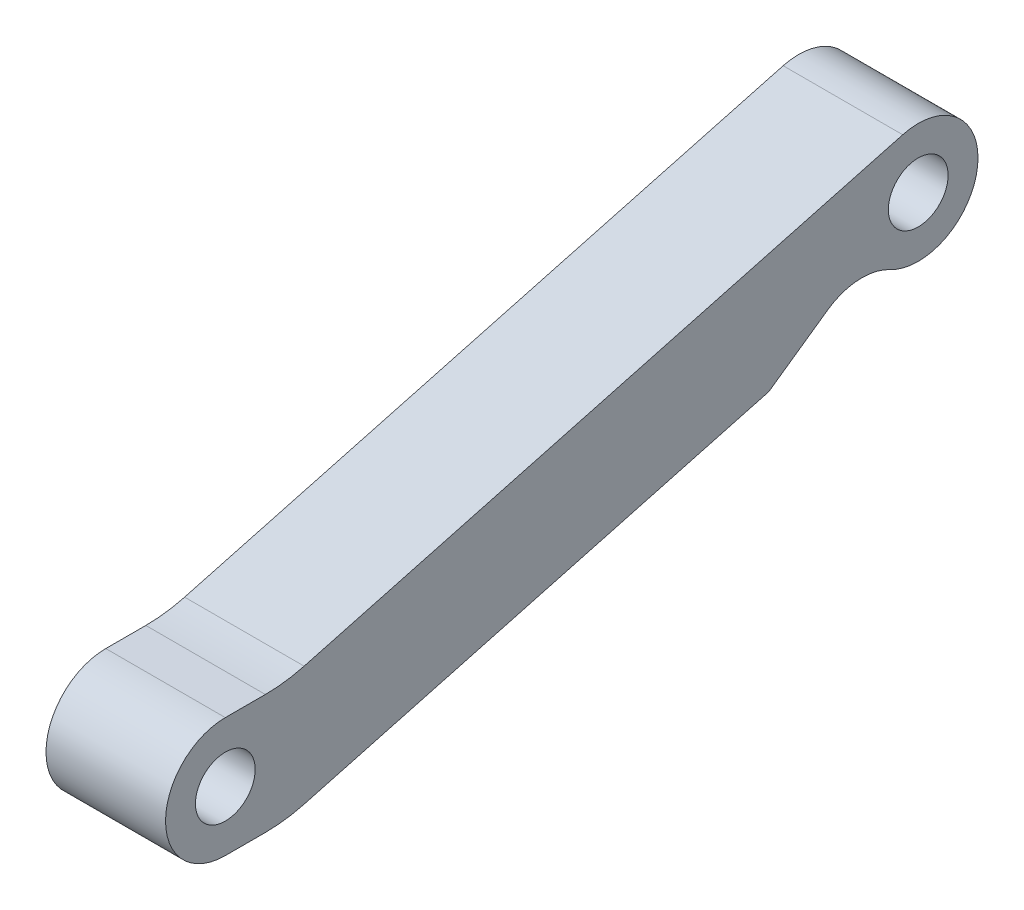
ISO-10303-21;
HEADER;
FILE_DESCRIPTION(('STEP AP214'),'2;1');
FILE_NAME('part.step','',(''),(''),'','','');
FILE_SCHEMA(('AUTOMOTIVE_DESIGN { 1 0 10303 214 1 1 1 1 }'));
ENDSEC;
DATA;
#1=APPLICATION_CONTEXT('core data for automotive mechanical design processes');
#2=APPLICATION_PROTOCOL_DEFINITION('international standard','automotive_design',2000,#1);
#3=PRODUCT_CONTEXT('',#1,'mechanical');
#4=PRODUCT('Part','Part','',(#3));
#5=PRODUCT_RELATED_PRODUCT_CATEGORY('part','',(#4));
#6=PRODUCT_DEFINITION_FORMATION('','',#4);
#7=PRODUCT_DEFINITION_CONTEXT('part definition',#1,'design');
#8=PRODUCT_DEFINITION('design','',#6,#7);
#9=PRODUCT_DEFINITION_SHAPE('','',#8);
#10=(LENGTH_UNIT() NAMED_UNIT(*) SI_UNIT(.MILLI.,.METRE.));
#11=(NAMED_UNIT(*) PLANE_ANGLE_UNIT() SI_UNIT($,.RADIAN.));
#12=(NAMED_UNIT(*) SI_UNIT($,.STERADIAN.) SOLID_ANGLE_UNIT());
#13=UNCERTAINTY_MEASURE_WITH_UNIT(LENGTH_MEASURE(1.E-05),#10,'distance_accuracy_value','');
#14=(GEOMETRIC_REPRESENTATION_CONTEXT(3) GLOBAL_UNCERTAINTY_ASSIGNED_CONTEXT((#13)) GLOBAL_UNIT_ASSIGNED_CONTEXT((#10,
#11,#12)) REPRESENTATION_CONTEXT('',''));
#15=CARTESIAN_POINT('',(0.,0.,0.));
#16=DIRECTION('',(0.,0.,1.));
#17=DIRECTION('',(1.,0.,0.));
#18=AXIS2_PLACEMENT_3D('',#15,#16,#17);
#19=CARTESIAN_POINT('',(-2.,-1.90438017055621,-57.8615520486907));
#20=DIRECTION('',(1.,0.,0.));
#21=DIRECTION('',(0.,0.,-1.));
#22=AXIS2_PLACEMENT_3D('',#19,#20,#21);
#23=CYLINDRICAL_SURFACE('',#22,2.);
#24=DIRECTION('',(1.,0.,0.));
#25=VECTOR('',#24,1.);
#26=CARTESIAN_POINT('',(-2.,-0.139690085278114,-58.8027581381956));
#27=LINE('',#26,#25);
#28=CARTESIAN_POINT('',(-2.,-0.139690085278114,-58.8027581381956));
#29=VERTEX_POINT('',#28);
#30=CARTESIAN_POINT('',(2.,-0.139690085278114,-58.8027581381956));
#31=VERTEX_POINT('',#30);
#32=EDGE_CURVE('E43',#29,#31,#27,.T.);
#33=ORIENTED_EDGE('',*,*,#32,.T.);
#34=CARTESIAN_POINT('',(2.,-1.90438017055621,-57.8615520486907));
#35=DIRECTION('',(1.,0.,0.));
#36=DIRECTION('',(0.,0.,-1.));
#37=AXIS2_PLACEMENT_3D('',#34,#35,#36);
#38=CIRCLE('',#37,2.);
#39=CARTESIAN_POINT('',(2.,-0.267057165237533,-56.7129993175311));
#40=VERTEX_POINT('',#39);
#41=EDGE_CURVE('E120',#31,#40,#38,.T.);
#42=ORIENTED_EDGE('',*,*,#41,.T.);
#43=DIRECTION('',(1.,0.,0.));
#44=VECTOR('',#43,1.);
#45=CARTESIAN_POINT('',(-2.,-0.267057165237533,-56.7129993175311));
#46=LINE('',#45,#44);
#47=CARTESIAN_POINT('',(-2.,-0.267057165237533,-56.7129993175311));
#48=VERTEX_POINT('',#47);
#49=EDGE_CURVE('E11',#48,#40,#46,.T.);
#50=ORIENTED_EDGE('',*,*,#49,.F.);
#51=CARTESIAN_POINT('',(-2.,-1.90438017055621,-57.8615520486907));
#52=DIRECTION('',(1.,0.,0.));
#53=DIRECTION('',(0.,0.,-1.));
#54=AXIS2_PLACEMENT_3D('',#51,#52,#53);
#55=CIRCLE('',#54,2.);
#56=EDGE_CURVE('E56',#29,#48,#55,.T.);
#57=ORIENTED_EDGE('',*,*,#56,.F.);
#58=EDGE_LOOP('',(#33,#42,#50,#57));
#59=FACE_BOUND('',#58,.T.);
#60=ADVANCED_FACE('F39',(#59),#23,.F.);
#61=CARTESIAN_POINT('',(-2.,-26.8419168625447,-18.8291234056378));
#62=DIRECTION('',(0.,-0.818661502659338,-0.574276365579809));
#63=DIRECTION('',(0.,0.574276365579809,-0.818661502659338));
#64=AXIS2_PLACEMENT_3D('',#61,#62,#63);
#65=PLANE('',#64);
#66=ORIENTED_EDGE('',*,*,#49,.T.);
#67=DIRECTION('',(0.,0.574276365579809,-0.818661502659338));
#68=VECTOR('',#67,1.);
#69=CARTESIAN_POINT('',(2.,-26.8419168625447,-18.8291234056378));
#70=LINE('',#69,#68);
#71=CARTESIAN_POINT('',(2.,-1.64829997611087,-54.7439642277006));
#72=VERTEX_POINT('',#71);
#73=EDGE_CURVE('E137',#72,#40,#70,.T.);
#74=ORIENTED_EDGE('',*,*,#73,.F.);
#75=DIRECTION('',(1.,0.,0.));
#76=VECTOR('',#75,1.);
#77=CARTESIAN_POINT('',(-2.,-1.64829997611087,-54.7439642277006));
#78=LINE('',#77,#76);
#79=CARTESIAN_POINT('',(-2.,-1.64829997611087,-54.7439642277006));
#80=VERTEX_POINT('',#79);
#81=EDGE_CURVE('E48',#80,#72,#78,.T.);
#82=ORIENTED_EDGE('',*,*,#81,.F.);
#83=DIRECTION('',(0.,0.574276365579809,-0.818661502659338));
#84=VECTOR('',#83,1.);
#85=CARTESIAN_POINT('',(-2.,-26.8419168625447,-18.8291234056378));
#86=LINE('',#85,#84);
#87=EDGE_CURVE('E124',#80,#48,#86,.T.);
#88=ORIENTED_EDGE('',*,*,#87,.T.);
#89=EDGE_LOOP('',(#66,#74,#82,#88));
#90=FACE_BOUND('',#89,.T.);
#91=ADVANCED_FACE('F232',(#90),#65,.T.);
#92=CARTESIAN_POINT('',(-2.,-15.2636719956812,-4.10387449343897));
#93=DIRECTION('',(0.,-0.965704257834634,-0.259644538552343));
#94=DIRECTION('',(0.,0.259644538552343,-0.965704257834634));
#95=AXIS2_PLACEMENT_3D('',#92,#93,#94);
#96=PLANE('',#95);
#97=ORIENTED_EDGE('',*,*,#81,.T.);
#98=DIRECTION('',(0.,0.259644538552343,-0.965704257834634));
#99=VECTOR('',#98,1.);
#100=CARTESIAN_POINT('',(2.,-15.2636719956812,-4.10387449343897));
#101=LINE('',#100,#99);
#102=CARTESIAN_POINT('',(2.,-5.82852128917318,-39.1963330577057));
#103=VERTEX_POINT('',#102);
#104=EDGE_CURVE('E161',#103,#72,#101,.T.);
#105=ORIENTED_EDGE('',*,*,#104,.F.);
#106=DIRECTION('',(1.,0.,0.));
#107=VECTOR('',#106,1.);
#108=CARTESIAN_POINT('',(-2.,-5.82852128917318,-39.1963330577057));
#109=LINE('',#108,#107);
#110=CARTESIAN_POINT('',(-2.,-5.82852128917318,-39.1963330577057));
#111=VERTEX_POINT('',#110);
#112=EDGE_CURVE('E192',#111,#103,#109,.T.);
#113=ORIENTED_EDGE('',*,*,#112,.F.);
#114=DIRECTION('',(0.,0.259644538552343,-0.965704257834634));
#115=VECTOR('',#114,1.);
#116=CARTESIAN_POINT('',(-2.,-15.2636719956812,-4.10387449343897));
#117=LINE('',#116,#115);
#118=EDGE_CURVE('E188',#111,#80,#117,.T.);
#119=ORIENTED_EDGE('',*,*,#118,.T.);
#120=EDGE_LOOP('',(#97,#105,#113,#119));
#121=FACE_BOUND('',#120,.T.);
#122=ADVANCED_FACE('F230',(#121),#96,.T.);
#123=CARTESIAN_POINT('',(-2.,-1.00000000000001,-37.8981103649439));
#124=DIRECTION('',(1.,0.,0.));
#125=DIRECTION('',(0.,0.,-1.));
#126=AXIS2_PLACEMENT_3D('',#123,#124,#125);
#127=CYLINDRICAL_SURFACE('',#126,5.);
#128=ORIENTED_EDGE('',*,*,#112,.T.);
#129=CARTESIAN_POINT('',(2.,-1.00000000000001,-37.8981103649439));
#130=DIRECTION('',(1.,0.,0.));
#131=DIRECTION('',(0.,0.,-1.));
#132=AXIS2_PLACEMENT_3D('',#129,#130,#131);
#133=CIRCLE('',#132,5.);
#134=CARTESIAN_POINT('',(2.,-6.00000000000001,-37.8981103649439));
#135=VERTEX_POINT('',#134);
#136=EDGE_CURVE('E158',#135,#103,#133,.T.);
#137=ORIENTED_EDGE('',*,*,#136,.F.);
#138=DIRECTION('',(1.,0.,0.));
#139=VECTOR('',#138,1.);
#140=CARTESIAN_POINT('',(-2.,-6.00000000000001,-37.8981103649439));
#141=LINE('',#140,#139);
#142=CARTESIAN_POINT('',(-2.,-6.00000000000001,-37.8981103649439));
#143=VERTEX_POINT('',#142);
#144=EDGE_CURVE('E194',#143,#135,#141,.T.);
#145=ORIENTED_EDGE('',*,*,#144,.F.);
#146=CARTESIAN_POINT('',(-2.,-1.00000000000001,-37.8981103649439));
#147=DIRECTION('',(1.,0.,0.));
#148=DIRECTION('',(0.,0.,-1.));
#149=AXIS2_PLACEMENT_3D('',#146,#147,#148);
#150=CIRCLE('',#149,5.);
#151=EDGE_CURVE('E185',#143,#111,#150,.T.);
#152=ORIENTED_EDGE('',*,*,#151,.T.);
#153=EDGE_LOOP('',(#128,#137,#145,#152));
#154=FACE_BOUND('',#153,.T.);
#155=ADVANCED_FACE('F227',(#154),#127,.T.);
#156=CARTESIAN_POINT('',(-2.,-6.00000000000003,0.));
#157=DIRECTION('',(0.,-1.,0.));
#158=DIRECTION('',(0.,0.,-1.));
#159=AXIS2_PLACEMENT_3D('',#156,#157,#158);
#160=PLANE('',#159);
#161=ORIENTED_EDGE('',*,*,#144,.T.);
#162=DIRECTION('',(0.,0.,-1.));
#163=VECTOR('',#162,1.);
#164=CARTESIAN_POINT('',(2.,-6.00000000000003,0.));
#165=LINE('',#164,#163);
#166=CARTESIAN_POINT('',(2.,-6.00000000000001,-36.55854679));
#167=VERTEX_POINT('',#166);
#168=EDGE_CURVE('E155',#167,#135,#165,.T.);
#169=ORIENTED_EDGE('',*,*,#168,.F.);
#170=DIRECTION('',(1.,0.,0.));
#171=VECTOR('',#170,1.);
#172=CARTESIAN_POINT('',(-2.,-6.00000000000001,-36.55854679));
#173=LINE('',#172,#171);
#174=CARTESIAN_POINT('',(-2.,-6.00000000000001,-36.55854679));
#175=VERTEX_POINT('',#174);
#176=EDGE_CURVE('E196',#175,#167,#173,.T.);
#177=ORIENTED_EDGE('',*,*,#176,.F.);
#178=DIRECTION('',(0.,0.,-1.));
#179=VECTOR('',#178,1.);
#180=CARTESIAN_POINT('',(-2.,-6.00000000000003,0.));
#181=LINE('',#180,#179);
#182=EDGE_CURVE('E182',#175,#143,#181,.T.);
#183=ORIENTED_EDGE('',*,*,#182,.T.);
#184=EDGE_LOOP('',(#161,#169,#177,#183));
#185=FACE_BOUND('',#184,.T.);
#186=ADVANCED_FACE('F223',(#185),#160,.T.);
#187=CARTESIAN_POINT('',(-2.,-4.00000000000001,-36.55854679));
#188=DIRECTION('',(1.,0.,0.));
#189=DIRECTION('',(0.,0.,-1.));
#190=AXIS2_PLACEMENT_3D('',#187,#188,#189);
#191=CYLINDRICAL_SURFACE('',#190,2.);
#192=ORIENTED_EDGE('',*,*,#176,.T.);
#193=CARTESIAN_POINT('',(2.,-4.00000000000001,-36.55854679));
#194=DIRECTION('',(1.,0.,0.));
#195=DIRECTION('',(0.,0.,-1.));
#196=AXIS2_PLACEMENT_3D('',#193,#194,#195);
#197=CIRCLE('',#196,2.);
#198=CARTESIAN_POINT('',(2.,-2.00000000000001,-36.55854679));
#199=VERTEX_POINT('',#198);
#200=EDGE_CURVE('E152',#199,#167,#197,.T.);
#201=ORIENTED_EDGE('',*,*,#200,.F.);
#202=DIRECTION('',(1.,0.,0.));
#203=VECTOR('',#202,1.);
#204=CARTESIAN_POINT('',(-2.,-2.00000000000001,-36.55854679));
#205=LINE('',#204,#203);
#206=CARTESIAN_POINT('',(-2.,-2.00000000000001,-36.55854679));
#207=VERTEX_POINT('',#206);
#208=EDGE_CURVE('E198',#207,#199,#205,.T.);
#209=ORIENTED_EDGE('',*,*,#208,.F.);
#210=CARTESIAN_POINT('',(-2.,-4.00000000000001,-36.55854679));
#211=DIRECTION('',(1.,0.,0.));
#212=DIRECTION('',(0.,0.,-1.));
#213=AXIS2_PLACEMENT_3D('',#210,#211,#212);
#214=CIRCLE('',#213,2.);
#215=EDGE_CURVE('E179',#207,#175,#214,.T.);
#216=ORIENTED_EDGE('',*,*,#215,.T.);
#217=EDGE_LOOP('',(#192,#201,#209,#216));
#218=FACE_BOUND('',#217,.T.);
#219=ADVANCED_FACE('F220',(#218),#191,.T.);
#220=CARTESIAN_POINT('',(-2.,-2.00000000000001,0.));
#221=DIRECTION('',(0.,-1.,0.));
#222=DIRECTION('',(0.,0.,-1.));
#223=AXIS2_PLACEMENT_3D('',#220,#221,#222);
#224=PLANE('',#223);
#225=ORIENTED_EDGE('',*,*,#208,.T.);
#226=DIRECTION('',(0.,0.,-1.));
#227=VECTOR('',#226,1.);
#228=CARTESIAN_POINT('',(2.,-2.00000000000001,0.));
#229=LINE('',#228,#227);
#230=CARTESIAN_POINT('',(2.,-2.00000000000001,-37.8981103649439));
#231=VERTEX_POINT('',#230);
#232=EDGE_CURVE('E149',#199,#231,#229,.T.);
#233=ORIENTED_EDGE('',*,*,#232,.T.);
#234=DIRECTION('',(1.,0.,0.));
#235=VECTOR('',#234,1.);
#236=CARTESIAN_POINT('',(-2.,-2.00000000000001,-37.8981103649439));
#237=LINE('',#236,#235);
#238=CARTESIAN_POINT('',(-2.,-2.00000000000001,-37.8981103649439));
#239=VERTEX_POINT('',#238);
#240=EDGE_CURVE('E200',#239,#231,#237,.T.);
#241=ORIENTED_EDGE('',*,*,#240,.F.);
#242=DIRECTION('',(0.,0.,-1.));
#243=VECTOR('',#242,1.);
#244=CARTESIAN_POINT('',(-2.,-2.00000000000001,0.));
#245=LINE('',#244,#243);
#246=EDGE_CURVE('E177',#207,#239,#245,.T.);
#247=ORIENTED_EDGE('',*,*,#246,.F.);
#248=EDGE_LOOP('',(#225,#233,#241,#247));
#249=FACE_BOUND('',#248,.T.);
#250=ADVANCED_FACE('F215',(#249),#224,.F.);
#251=CARTESIAN_POINT('',(-2.,2.99999999999999,-37.8981103649439));
#252=DIRECTION('',(1.,0.,0.));
#253=DIRECTION('',(0.,0.,-1.));
#254=AXIS2_PLACEMENT_3D('',#251,#252,#253);
#255=CYLINDRICAL_SURFACE('',#254,5.);
#256=ORIENTED_EDGE('',*,*,#240,.T.);
#257=CARTESIAN_POINT('',(2.,2.99999999999999,-37.8981103649439));
#258=DIRECTION('',(1.,0.,0.));
#259=DIRECTION('',(0.,0.,-1.));
#260=AXIS2_PLACEMENT_3D('',#257,#258,#259);
#261=CIRCLE('',#260,5.);
#262=CARTESIAN_POINT('',(2.,-1.82852128917317,-39.1963330577057));
#263=VERTEX_POINT('',#262);
#264=EDGE_CURVE('E146',#231,#263,#261,.T.);
#265=ORIENTED_EDGE('',*,*,#264,.T.);
#266=DIRECTION('',(1.,0.,0.));
#267=VECTOR('',#266,1.);
#268=CARTESIAN_POINT('',(-2.,-1.82852128917317,-39.1963330577057));
#269=LINE('',#268,#267);
#270=CARTESIAN_POINT('',(-2.,-1.82852128917317,-39.1963330577057));
#271=VERTEX_POINT('',#270);
#272=EDGE_CURVE('E202',#271,#263,#269,.T.);
#273=ORIENTED_EDGE('',*,*,#272,.F.);
#274=CARTESIAN_POINT('',(-2.,2.99999999999999,-37.8981103649439));
#275=DIRECTION('',(1.,0.,0.));
#276=DIRECTION('',(0.,0.,-1.));
#277=AXIS2_PLACEMENT_3D('',#274,#275,#276);
#278=CIRCLE('',#277,5.);
#279=EDGE_CURVE('E175',#239,#271,#278,.T.);
#280=ORIENTED_EDGE('',*,*,#279,.F.);
#281=EDGE_LOOP('',(#256,#265,#273,#280));
#282=FACE_BOUND('',#281,.T.);
#283=ADVANCED_FACE('F211',(#282),#255,.F.);
#284=CARTESIAN_POINT('',(-2.,-11.5333331412814,-3.10091514782494));
#285=DIRECTION('',(0.,-0.965704257834634,-0.259644538552343));
#286=DIRECTION('',(0.,0.259644538552343,-0.965704257834634));
#287=AXIS2_PLACEMENT_3D('',#284,#285,#286);
#288=PLANE('',#287);
#289=ORIENTED_EDGE('',*,*,#272,.T.);
#290=DIRECTION('',(0.,0.259644538552343,-0.965704257834634));
#291=VECTOR('',#290,1.);
#292=CARTESIAN_POINT('',(2.,-11.5333331412814,-3.10091514782494));
#293=LINE('',#292,#291);
#294=CARTESIAN_POINT('',(2.,3.55640851566925,-59.2246751505959));
#295=VERTEX_POINT('',#294);
#296=EDGE_CURVE('E132',#263,#295,#293,.T.);
#297=ORIENTED_EDGE('',*,*,#296,.T.);
#298=DIRECTION('',(1.,0.,0.));
#299=VECTOR('',#298,1.);
#300=CARTESIAN_POINT('',(-2.,3.55640851566925,-59.2246751505959));
#301=LINE('',#300,#299);
#302=CARTESIAN_POINT('',(-2.,3.55640851566925,-59.2246751505959));
#303=VERTEX_POINT('',#302);
#304=EDGE_CURVE('E123',#303,#295,#301,.T.);
#305=ORIENTED_EDGE('',*,*,#304,.F.);
#306=DIRECTION('',(0.,0.259644538552343,-0.965704257834634));
#307=VECTOR('',#306,1.);
#308=CARTESIAN_POINT('',(-2.,-11.5333331412814,-3.10091514782494));
#309=LINE('',#308,#307);
#310=EDGE_CURVE('E173',#271,#303,#309,.T.);
#311=ORIENTED_EDGE('',*,*,#310,.F.);
#312=EDGE_LOOP('',(#289,#297,#305,#311));
#313=FACE_BOUND('',#312,.T.);
#314=ADVANCED_FACE('F206',(#313),#288,.F.);
#315=CARTESIAN_POINT('',(-2.,1.62499999999998,-59.7439642277006));
#316=DIRECTION('',(1.,0.,0.));
#317=DIRECTION('',(0.,0.,-1.));
#318=AXIS2_PLACEMENT_3D('',#315,#316,#317);
#319=CYLINDRICAL_SURFACE('',#318,1.00000000000001);
#320=CARTESIAN_POINT('',(-2.,1.62499999999998,-59.7439642277006));
#321=DIRECTION('',(1.,0.,0.));
#322=DIRECTION('',(0.,0.,-1.));
#323=AXIS2_PLACEMENT_3D('',#320,#321,#322);
#324=CIRCLE('',#323,1.00000000000001);
#325=CARTESIAN_POINT('',(-2.,1.62499999999998,-60.7439642277006));
#326=VERTEX_POINT('',#325);
#327=EDGE_CURVE('E167',#326,#326,#324,.T.);
#328=ORIENTED_EDGE('',*,*,#327,.F.);
#329=EDGE_LOOP('',(#328));
#330=FACE_BOUND('',#329,.T.);
#331=CARTESIAN_POINT('',(2.,1.62499999999998,-59.7439642277006));
#332=DIRECTION('',(1.,0.,0.));
#333=DIRECTION('',(0.,0.,-1.));
#334=AXIS2_PLACEMENT_3D('',#331,#332,#333);
#335=CIRCLE('',#334,1.00000000000001);
#336=CARTESIAN_POINT('',(2.,1.62499999999998,-60.7439642277006));
#337=VERTEX_POINT('',#336);
#338=EDGE_CURVE('E138',#337,#337,#335,.T.);
#339=ORIENTED_EDGE('',*,*,#338,.T.);
#340=EDGE_LOOP('',(#339));
#341=FACE_BOUND('',#340,.T.);
#342=ADVANCED_FACE('F252',(#330,#341),#319,.F.);
#343=CARTESIAN_POINT('',(-2.,-4.00000000000001,-36.55854679));
#344=DIRECTION('',(1.,0.,0.));
#345=DIRECTION('',(0.,0.,-1.));
#346=AXIS2_PLACEMENT_3D('',#343,#344,#345);
#347=CYLINDRICAL_SURFACE('',#346,1.00000000000001);
#348=CARTESIAN_POINT('',(-2.,-4.00000000000001,-36.55854679));
#349=DIRECTION('',(1.,0.,0.));
#350=DIRECTION('',(0.,0.,-1.));
#351=AXIS2_PLACEMENT_3D('',#348,#349,#350);
#352=CIRCLE('',#351,1.00000000000001);
#353=CARTESIAN_POINT('',(-2.,-4.00000000000001,-37.55854679));
#354=VERTEX_POINT('',#353);
#355=EDGE_CURVE('E164',#354,#354,#352,.T.);
#356=ORIENTED_EDGE('',*,*,#355,.F.);
#357=EDGE_LOOP('',(#356));
#358=FACE_BOUND('',#357,.T.);
#359=CARTESIAN_POINT('',(2.,-4.00000000000001,-36.55854679));
#360=DIRECTION('',(1.,0.,0.));
#361=DIRECTION('',(0.,0.,-1.));
#362=AXIS2_PLACEMENT_3D('',#359,#360,#361);
#363=CIRCLE('',#362,1.00000000000001);
#364=CARTESIAN_POINT('',(2.,-4.00000000000001,-37.55854679));
#365=VERTEX_POINT('',#364);
#366=EDGE_CURVE('E141',#365,#365,#363,.T.);
#367=ORIENTED_EDGE('',*,*,#366,.T.);
#368=EDGE_LOOP('',(#367));
#369=FACE_BOUND('',#368,.T.);
#370=ADVANCED_FACE('F41',(#358,#369),#347,.F.);
#371=CARTESIAN_POINT('',(-2.,1.62499999999998,-59.7439642277006));
#372=DIRECTION('',(1.,0.,0.));
#373=DIRECTION('',(0.,0.,-1.));
#374=AXIS2_PLACEMENT_3D('',#371,#372,#373);
#375=CYLINDRICAL_SURFACE('',#374,2.);
#376=ORIENTED_EDGE('',*,*,#304,.T.);
#377=CARTESIAN_POINT('',(2.,1.62499999999998,-59.7439642277006));
#378=DIRECTION('',(1.,0.,0.));
#379=DIRECTION('',(0.,0.,-1.));
#380=AXIS2_PLACEMENT_3D('',#377,#378,#379);
#381=CIRCLE('',#380,2.);
#382=EDGE_CURVE('E126',#31,#295,#381,.T.);
#383=ORIENTED_EDGE('',*,*,#382,.F.);
#384=ORIENTED_EDGE('',*,*,#32,.F.);
#385=CARTESIAN_POINT('',(-2.,1.62499999999998,-59.7439642277006));
#386=DIRECTION('',(1.,0.,0.));
#387=DIRECTION('',(0.,0.,-1.));
#388=AXIS2_PLACEMENT_3D('',#385,#386,#387);
#389=CIRCLE('',#388,2.);
#390=EDGE_CURVE('E171',#29,#303,#389,.T.);
#391=ORIENTED_EDGE('',*,*,#390,.T.);
#392=EDGE_LOOP('',(#376,#383,#384,#391));
#393=FACE_BOUND('',#392,.T.);
#394=ADVANCED_FACE('F127',(#393),#375,.T.);
#395=CARTESIAN_POINT('',(-2.,0.,0.));
#396=DIRECTION('',(1.,0.,0.));
#397=DIRECTION('',(0.,0.,-1.));
#398=AXIS2_PLACEMENT_3D('',#395,#396,#397);
#399=PLANE('',#398);
#400=ORIENTED_EDGE('',*,*,#355,.T.);
#401=EDGE_LOOP('',(#400));
#402=FACE_BOUND('',#401,.T.);
#403=ORIENTED_EDGE('',*,*,#327,.T.);
#404=EDGE_LOOP('',(#403));
#405=FACE_BOUND('',#404,.T.);
#406=ORIENTED_EDGE('',*,*,#56,.T.);
#407=ORIENTED_EDGE('',*,*,#87,.F.);
#408=ORIENTED_EDGE('',*,*,#118,.F.);
#409=ORIENTED_EDGE('',*,*,#151,.F.);
#410=ORIENTED_EDGE('',*,*,#182,.F.);
#411=ORIENTED_EDGE('',*,*,#215,.F.);
#412=ORIENTED_EDGE('',*,*,#246,.T.);
#413=ORIENTED_EDGE('',*,*,#279,.T.);
#414=ORIENTED_EDGE('',*,*,#310,.T.);
#415=ORIENTED_EDGE('',*,*,#390,.F.);
#416=EDGE_LOOP('',(#406,#407,#408,#409,#410,#411,#412,#413,#414,#415));
#417=FACE_BOUND('',#416,.T.);
#418=ADVANCED_FACE('F233',(#402,#405,#417),#399,.F.);
#419=CARTESIAN_POINT('',(2.,0.,0.));
#420=DIRECTION('',(1.,0.,0.));
#421=DIRECTION('',(0.,0.,-1.));
#422=AXIS2_PLACEMENT_3D('',#419,#420,#421);
#423=PLANE('',#422);
#424=ORIENTED_EDGE('',*,*,#366,.F.);
#425=EDGE_LOOP('',(#424));
#426=FACE_BOUND('',#425,.T.);
#427=ORIENTED_EDGE('',*,*,#338,.F.);
#428=EDGE_LOOP('',(#427));
#429=FACE_BOUND('',#428,.T.);
#430=ORIENTED_EDGE('',*,*,#41,.F.);
#431=ORIENTED_EDGE('',*,*,#382,.T.);
#432=ORIENTED_EDGE('',*,*,#296,.F.);
#433=ORIENTED_EDGE('',*,*,#264,.F.);
#434=ORIENTED_EDGE('',*,*,#232,.F.);
#435=ORIENTED_EDGE('',*,*,#200,.T.);
#436=ORIENTED_EDGE('',*,*,#168,.T.);
#437=ORIENTED_EDGE('',*,*,#136,.T.);
#438=ORIENTED_EDGE('',*,*,#104,.T.);
#439=ORIENTED_EDGE('',*,*,#73,.T.);
#440=EDGE_LOOP('',(#430,#431,#432,#433,#434,#435,#436,#437,#438,#439));
#441=FACE_BOUND('',#440,.T.);
#442=ADVANCED_FACE('F135',(#426,#429,#441),#423,.T.);
#443=CLOSED_SHELL('',(#60,#91,#122,#155,#186,#219,#250,#283,#314,#342,#370,#394,#418,#442));
#444=MANIFOLD_SOLID_BREP('B2',#443);
#445=ADVANCED_BREP_SHAPE_REPRESENTATION('',(#18,#444),#14);
#446=SHAPE_DEFINITION_REPRESENTATION(#9,#445);
ENDSEC;
END-ISO-10303-21;
